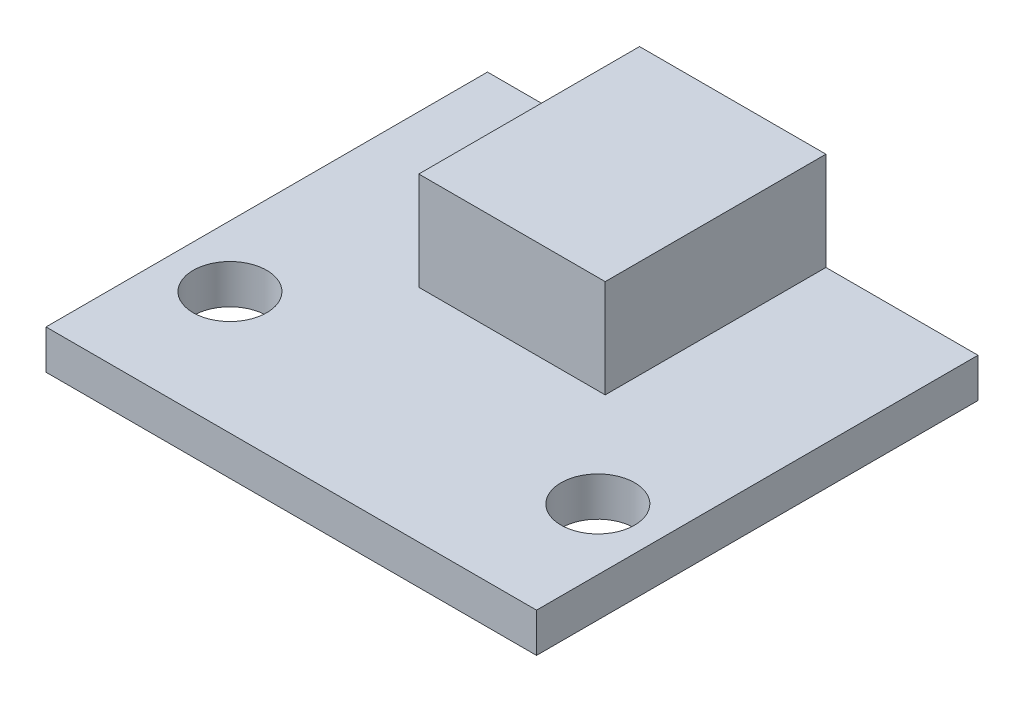
ISO-10303-21;
HEADER;
FILE_DESCRIPTION(('STEP AP214'),'2;1');
FILE_NAME('part.step','',(''),(''),'','','');
FILE_SCHEMA(('AUTOMOTIVE_DESIGN { 1 0 10303 214 1 1 1 1 }'));
ENDSEC;
DATA;
#1=APPLICATION_CONTEXT('core data for automotive mechanical design processes');
#2=APPLICATION_PROTOCOL_DEFINITION('international standard','automotive_design',2000,#1);
#3=PRODUCT_CONTEXT('',#1,'mechanical');
#4=PRODUCT('Part','Part','',(#3));
#5=PRODUCT_RELATED_PRODUCT_CATEGORY('part','',(#4));
#6=PRODUCT_DEFINITION_FORMATION('','',#4);
#7=PRODUCT_DEFINITION_CONTEXT('part definition',#1,'design');
#8=PRODUCT_DEFINITION('design','',#6,#7);
#9=PRODUCT_DEFINITION_SHAPE('','',#8);
#10=(LENGTH_UNIT() NAMED_UNIT(*) SI_UNIT(.MILLI.,.METRE.));
#11=(NAMED_UNIT(*) PLANE_ANGLE_UNIT() SI_UNIT($,.RADIAN.));
#12=(NAMED_UNIT(*) SI_UNIT($,.STERADIAN.) SOLID_ANGLE_UNIT());
#13=UNCERTAINTY_MEASURE_WITH_UNIT(LENGTH_MEASURE(1.E-05),#10,'distance_accuracy_value','');
#14=(GEOMETRIC_REPRESENTATION_CONTEXT(3) GLOBAL_UNCERTAINTY_ASSIGNED_CONTEXT((#13)) GLOBAL_UNIT_ASSIGNED_CONTEXT((#10,
#11,#12)) REPRESENTATION_CONTEXT('',''));
#15=CARTESIAN_POINT('',(0.,0.,0.));
#16=DIRECTION('',(0.,0.,1.));
#17=DIRECTION('',(1.,0.,0.));
#18=AXIS2_PLACEMENT_3D('',#15,#16,#17);
#19=CARTESIAN_POINT('',(0.,1.6,0.));
#20=DIRECTION('',(0.,-1.,0.));
#21=DIRECTION('',(0.,0.,-1.));
#22=AXIS2_PLACEMENT_3D('',#19,#20,#21);
#23=PLANE('',#22);
#24=CARTESIAN_POINT('',(17.5,1.6,-5.));
#25=DIRECTION('',(0.,1.,0.));
#26=DIRECTION('',(0.,0.,-1.));
#27=AXIS2_PLACEMENT_3D('',#24,#25,#26);
#28=CIRCLE('',#27,1.5);
#29=CARTESIAN_POINT('',(17.5,1.6,-6.5));
#30=VERTEX_POINT('',#29);
#31=EDGE_CURVE('E125',#30,#30,#28,.T.);
#32=ORIENTED_EDGE('',*,*,#31,.F.);
#33=EDGE_LOOP('',(#32));
#34=FACE_BOUND('',#33,.T.);
#35=CARTESIAN_POINT('',(2.5,1.6,-5.));
#36=DIRECTION('',(0.,1.,0.));
#37=DIRECTION('',(0.,0.,1.));
#38=AXIS2_PLACEMENT_3D('',#35,#36,#37);
#39=CIRCLE('',#38,1.5);
#40=CARTESIAN_POINT('',(2.5,1.6,-3.5));
#41=VERTEX_POINT('',#40);
#42=EDGE_CURVE('E134',#41,#41,#39,.T.);
#43=ORIENTED_EDGE('',*,*,#42,.F.);
#44=EDGE_LOOP('',(#43));
#45=FACE_BOUND('',#44,.T.);
#46=DIRECTION('',(0.,0.,1.));
#47=VECTOR('',#46,1.);
#48=CARTESIAN_POINT('',(6.2,1.6,-18.));
#49=LINE('',#48,#47);
#50=CARTESIAN_POINT('',(6.2,1.6,-18.));
#51=VERTEX_POINT('',#50);
#52=CARTESIAN_POINT('',(6.2,1.6,-9.));
#53=VERTEX_POINT('',#52);
#54=EDGE_CURVE('E57',#51,#53,#49,.T.);
#55=ORIENTED_EDGE('',*,*,#54,.F.);
#56=DIRECTION('',(-1.,0.,0.));
#57=VECTOR('',#56,1.);
#58=CARTESIAN_POINT('',(0.,1.6,-18.));
#59=LINE('',#58,#57);
#60=CARTESIAN_POINT('',(0.,1.6,-18.));
#61=VERTEX_POINT('',#60);
#62=EDGE_CURVE('E148',#51,#61,#59,.T.);
#63=ORIENTED_EDGE('',*,*,#62,.T.);
#64=DIRECTION('',(0.,0.,1.));
#65=VECTOR('',#64,1.);
#66=CARTESIAN_POINT('',(0.,1.6,0.));
#67=LINE('',#66,#65);
#68=CARTESIAN_POINT('',(0.,1.6,0.));
#69=VERTEX_POINT('',#68);
#70=EDGE_CURVE('E140',#61,#69,#67,.T.);
#71=ORIENTED_EDGE('',*,*,#70,.T.);
#72=DIRECTION('',(1.,0.,0.));
#73=VECTOR('',#72,1.);
#74=CARTESIAN_POINT('',(0.,1.6,0.));
#75=LINE('',#74,#73);
#76=CARTESIAN_POINT('',(20.,1.6,0.));
#77=VERTEX_POINT('',#76);
#78=EDGE_CURVE('E143',#69,#77,#75,.T.);
#79=ORIENTED_EDGE('',*,*,#78,.T.);
#80=DIRECTION('',(0.,0.,-1.));
#81=VECTOR('',#80,1.);
#82=CARTESIAN_POINT('',(20.,1.6,0.));
#83=LINE('',#82,#81);
#84=CARTESIAN_POINT('',(20.,1.6,-18.));
#85=VERTEX_POINT('',#84);
#86=EDGE_CURVE('E146',#77,#85,#83,.T.);
#87=ORIENTED_EDGE('',*,*,#86,.T.);
#88=CARTESIAN_POINT('',(13.8,1.6,-18.));
#89=VERTEX_POINT('',#88);
#90=EDGE_CURVE('E149',#85,#89,#59,.T.);
#91=ORIENTED_EDGE('',*,*,#90,.T.);
#92=DIRECTION('',(0.,0.,-1.));
#93=VECTOR('',#92,1.);
#94=CARTESIAN_POINT('',(13.8,1.6,-18.));
#95=LINE('',#94,#93);
#96=CARTESIAN_POINT('',(13.8,1.6,-9.));
#97=VERTEX_POINT('',#96);
#98=EDGE_CURVE('E119',#97,#89,#95,.T.);
#99=ORIENTED_EDGE('',*,*,#98,.F.);
#100=DIRECTION('',(1.,0.,0.));
#101=VECTOR('',#100,1.);
#102=CARTESIAN_POINT('',(6.2,1.6,-9.));
#103=LINE('',#102,#101);
#104=EDGE_CURVE('E52',#53,#97,#103,.T.);
#105=ORIENTED_EDGE('',*,*,#104,.F.);
#106=EDGE_LOOP('',(#55,#63,#71,#79,#87,#91,#99,#105));
#107=FACE_BOUND('',#106,.T.);
#108=ADVANCED_FACE('F37',(#34,#45,#107),#23,.F.);
#109=CARTESIAN_POINT('',(0.,0.,0.));
#110=DIRECTION('',(0.,-1.,0.));
#111=DIRECTION('',(0.,0.,-1.));
#112=AXIS2_PLACEMENT_3D('',#109,#110,#111);
#113=PLANE('',#112);
#114=CARTESIAN_POINT('',(2.5,0.,-5.));
#115=DIRECTION('',(0.,1.,0.));
#116=DIRECTION('',(0.,0.,1.));
#117=AXIS2_PLACEMENT_3D('',#114,#115,#116);
#118=CIRCLE('',#117,1.5);
#119=CARTESIAN_POINT('',(2.5,0.,-3.5));
#120=VERTEX_POINT('',#119);
#121=EDGE_CURVE('E132',#120,#120,#118,.T.);
#122=ORIENTED_EDGE('',*,*,#121,.T.);
#123=EDGE_LOOP('',(#122));
#124=FACE_BOUND('',#123,.T.);
#125=DIRECTION('',(0.,0.,1.));
#126=VECTOR('',#125,1.);
#127=CARTESIAN_POINT('',(0.,0.,0.));
#128=LINE('',#127,#126);
#129=CARTESIAN_POINT('',(0.,0.,-18.));
#130=VERTEX_POINT('',#129);
#131=CARTESIAN_POINT('',(0.,0.,0.));
#132=VERTEX_POINT('',#131);
#133=EDGE_CURVE('E137',#130,#132,#128,.T.);
#134=ORIENTED_EDGE('',*,*,#133,.F.);
#135=DIRECTION('',(-1.,0.,0.));
#136=VECTOR('',#135,1.);
#137=CARTESIAN_POINT('',(0.,0.,-18.));
#138=LINE('',#137,#136);
#139=CARTESIAN_POINT('',(20.,0.,-18.));
#140=VERTEX_POINT('',#139);
#141=EDGE_CURVE('E144',#140,#130,#138,.T.);
#142=ORIENTED_EDGE('',*,*,#141,.F.);
#143=DIRECTION('',(0.,0.,-1.));
#144=VECTOR('',#143,1.);
#145=CARTESIAN_POINT('',(20.,0.,0.));
#146=LINE('',#145,#144);
#147=CARTESIAN_POINT('',(20.,0.,0.));
#148=VERTEX_POINT('',#147);
#149=EDGE_CURVE('E156',#148,#140,#146,.T.);
#150=ORIENTED_EDGE('',*,*,#149,.F.);
#151=DIRECTION('',(1.,0.,0.));
#152=VECTOR('',#151,1.);
#153=CARTESIAN_POINT('',(0.,0.,0.));
#154=LINE('',#153,#152);
#155=EDGE_CURVE('E154',#132,#148,#154,.T.);
#156=ORIENTED_EDGE('',*,*,#155,.F.);
#157=EDGE_LOOP('',(#134,#142,#150,#156));
#158=FACE_BOUND('',#157,.T.);
#159=CARTESIAN_POINT('',(17.5,0.,-5.));
#160=DIRECTION('',(0.,1.,0.));
#161=DIRECTION('',(0.,0.,-1.));
#162=AXIS2_PLACEMENT_3D('',#159,#160,#161);
#163=CIRCLE('',#162,1.5);
#164=CARTESIAN_POINT('',(17.5,0.,-6.5));
#165=VERTEX_POINT('',#164);
#166=EDGE_CURVE('E122',#165,#165,#163,.T.);
#167=ORIENTED_EDGE('',*,*,#166,.T.);
#168=EDGE_LOOP('',(#167));
#169=FACE_BOUND('',#168,.T.);
#170=ADVANCED_FACE('F174',(#124,#158,#169),#113,.T.);
#171=CARTESIAN_POINT('',(0.,1.6,0.));
#172=DIRECTION('',(1.,0.,0.));
#173=DIRECTION('',(0.,0.,-1.));
#174=AXIS2_PLACEMENT_3D('',#171,#172,#173);
#175=PLANE('',#174);
#176=ORIENTED_EDGE('',*,*,#133,.T.);
#177=DIRECTION('',(0.,-1.,0.));
#178=VECTOR('',#177,1.);
#179=CARTESIAN_POINT('',(0.,1.6,0.));
#180=LINE('',#179,#178);
#181=EDGE_CURVE('E11',#69,#132,#180,.T.);
#182=ORIENTED_EDGE('',*,*,#181,.F.);
#183=ORIENTED_EDGE('',*,*,#70,.F.);
#184=DIRECTION('',(0.,-1.,0.));
#185=VECTOR('',#184,1.);
#186=CARTESIAN_POINT('',(0.,1.6,-18.));
#187=LINE('',#186,#185);
#188=EDGE_CURVE('E151',#61,#130,#187,.T.);
#189=ORIENTED_EDGE('',*,*,#188,.T.);
#190=EDGE_LOOP('',(#176,#182,#183,#189));
#191=FACE_BOUND('',#190,.T.);
#192=ADVANCED_FACE('F39',(#191),#175,.F.);
#193=CARTESIAN_POINT('',(0.,1.6,0.));
#194=DIRECTION('',(0.,0.,-1.));
#195=DIRECTION('',(-1.,0.,0.));
#196=AXIS2_PLACEMENT_3D('',#193,#194,#195);
#197=PLANE('',#196);
#198=ORIENTED_EDGE('',*,*,#155,.T.);
#199=DIRECTION('',(0.,-1.,0.));
#200=VECTOR('',#199,1.);
#201=CARTESIAN_POINT('',(20.,1.6,0.));
#202=LINE('',#201,#200);
#203=EDGE_CURVE('E45',#77,#148,#202,.T.);
#204=ORIENTED_EDGE('',*,*,#203,.F.);
#205=ORIENTED_EDGE('',*,*,#78,.F.);
#206=ORIENTED_EDGE('',*,*,#181,.T.);
#207=EDGE_LOOP('',(#198,#204,#205,#206));
#208=FACE_BOUND('',#207,.T.);
#209=ADVANCED_FACE('F220',(#208),#197,.F.);
#210=CARTESIAN_POINT('',(20.,1.6,0.));
#211=DIRECTION('',(-1.,0.,0.));
#212=DIRECTION('',(0.,0.,1.));
#213=AXIS2_PLACEMENT_3D('',#210,#211,#212);
#214=PLANE('',#213);
#215=ORIENTED_EDGE('',*,*,#149,.T.);
#216=DIRECTION('',(0.,-1.,0.));
#217=VECTOR('',#216,1.);
#218=CARTESIAN_POINT('',(20.,1.6,-18.));
#219=LINE('',#218,#217);
#220=EDGE_CURVE('E161',#85,#140,#219,.T.);
#221=ORIENTED_EDGE('',*,*,#220,.F.);
#222=ORIENTED_EDGE('',*,*,#86,.F.);
#223=ORIENTED_EDGE('',*,*,#203,.T.);
#224=EDGE_LOOP('',(#215,#221,#222,#223));
#225=FACE_BOUND('',#224,.T.);
#226=ADVANCED_FACE('F168',(#225),#214,.F.);
#227=CARTESIAN_POINT('',(0.,1.6,-18.));
#228=DIRECTION('',(0.,0.,1.));
#229=DIRECTION('',(1.,0.,0.));
#230=AXIS2_PLACEMENT_3D('',#227,#228,#229);
#231=PLANE('',#230);
#232=ORIENTED_EDGE('',*,*,#141,.T.);
#233=ORIENTED_EDGE('',*,*,#188,.F.);
#234=ORIENTED_EDGE('',*,*,#62,.F.);
#235=DIRECTION('',(0.,-1.,0.));
#236=VECTOR('',#235,1.);
#237=CARTESIAN_POINT('',(6.2,5.6,-18.));
#238=LINE('',#237,#236);
#239=CARTESIAN_POINT('',(6.2,5.6,-18.));
#240=VERTEX_POINT('',#239);
#241=EDGE_CURVE('E183',#240,#51,#238,.T.);
#242=ORIENTED_EDGE('',*,*,#241,.F.);
#243=DIRECTION('',(-1.,0.,0.));
#244=VECTOR('',#243,1.);
#245=CARTESIAN_POINT('',(6.2,5.6,-18.));
#246=LINE('',#245,#244);
#247=CARTESIAN_POINT('',(13.8,5.6,-18.));
#248=VERTEX_POINT('',#247);
#249=EDGE_CURVE('E115',#248,#240,#246,.T.);
#250=ORIENTED_EDGE('',*,*,#249,.F.);
#251=DIRECTION('',(0.,-1.,0.));
#252=VECTOR('',#251,1.);
#253=CARTESIAN_POINT('',(13.8,5.6,-18.));
#254=LINE('',#253,#252);
#255=EDGE_CURVE('E127',#248,#89,#254,.T.);
#256=ORIENTED_EDGE('',*,*,#255,.T.);
#257=ORIENTED_EDGE('',*,*,#90,.F.);
#258=ORIENTED_EDGE('',*,*,#220,.T.);
#259=EDGE_LOOP('',(#232,#233,#234,#242,#250,#256,#257,#258));
#260=FACE_BOUND('',#259,.T.);
#261=ADVANCED_FACE('F178',(#260),#231,.F.);
#262=CARTESIAN_POINT('',(2.5,1.6,-5.));
#263=DIRECTION('',(0.,-1.,0.));
#264=DIRECTION('',(0.,0.,-1.));
#265=AXIS2_PLACEMENT_3D('',#262,#263,#264);
#266=CYLINDRICAL_SURFACE('',#265,1.5);
#267=ORIENTED_EDGE('',*,*,#42,.T.);
#268=EDGE_LOOP('',(#267));
#269=FACE_BOUND('',#268,.T.);
#270=ORIENTED_EDGE('',*,*,#121,.F.);
#271=EDGE_LOOP('',(#270));
#272=FACE_BOUND('',#271,.T.);
#273=ADVANCED_FACE('F214',(#269,#272),#266,.F.);
#274=CARTESIAN_POINT('',(17.5,1.6,-5.));
#275=DIRECTION('',(0.,-1.,0.));
#276=DIRECTION('',(0.,0.,-1.));
#277=AXIS2_PLACEMENT_3D('',#274,#275,#276);
#278=CYLINDRICAL_SURFACE('',#277,1.5);
#279=ORIENTED_EDGE('',*,*,#31,.T.);
#280=EDGE_LOOP('',(#279));
#281=FACE_BOUND('',#280,.T.);
#282=ORIENTED_EDGE('',*,*,#166,.F.);
#283=EDGE_LOOP('',(#282));
#284=FACE_BOUND('',#283,.T.);
#285=ADVANCED_FACE('F261',(#281,#284),#278,.F.);
#286=CARTESIAN_POINT('',(6.2,5.6,-18.));
#287=DIRECTION('',(1.,0.,0.));
#288=DIRECTION('',(0.,0.,-1.));
#289=AXIS2_PLACEMENT_3D('',#286,#287,#288);
#290=PLANE('',#289);
#291=ORIENTED_EDGE('',*,*,#54,.T.);
#292=DIRECTION('',(0.,-1.,0.));
#293=VECTOR('',#292,1.);
#294=CARTESIAN_POINT('',(6.2,5.6,-9.));
#295=LINE('',#294,#293);
#296=CARTESIAN_POINT('',(6.2,5.6,-9.));
#297=VERTEX_POINT('',#296);
#298=EDGE_CURVE('E104',#297,#53,#295,.T.);
#299=ORIENTED_EDGE('',*,*,#298,.F.);
#300=DIRECTION('',(0.,0.,1.));
#301=VECTOR('',#300,1.);
#302=CARTESIAN_POINT('',(6.2,5.6,-18.));
#303=LINE('',#302,#301);
#304=EDGE_CURVE('E110',#240,#297,#303,.T.);
#305=ORIENTED_EDGE('',*,*,#304,.F.);
#306=ORIENTED_EDGE('',*,*,#241,.T.);
#307=EDGE_LOOP('',(#291,#299,#305,#306));
#308=FACE_BOUND('',#307,.T.);
#309=ADVANCED_FACE('F121',(#308),#290,.F.);
#310=CARTESIAN_POINT('',(6.2,5.6,-9.));
#311=DIRECTION('',(0.,0.,-1.));
#312=DIRECTION('',(-1.,0.,0.));
#313=AXIS2_PLACEMENT_3D('',#310,#311,#312);
#314=PLANE('',#313);
#315=ORIENTED_EDGE('',*,*,#104,.T.);
#316=DIRECTION('',(0.,-1.,0.));
#317=VECTOR('',#316,1.);
#318=CARTESIAN_POINT('',(13.8,5.6,-9.));
#319=LINE('',#318,#317);
#320=CARTESIAN_POINT('',(13.8,5.6,-9.));
#321=VERTEX_POINT('',#320);
#322=EDGE_CURVE('E106',#321,#97,#319,.T.);
#323=ORIENTED_EDGE('',*,*,#322,.F.);
#324=DIRECTION('',(1.,0.,0.));
#325=VECTOR('',#324,1.);
#326=CARTESIAN_POINT('',(6.2,5.6,-9.));
#327=LINE('',#326,#325);
#328=EDGE_CURVE('E100',#297,#321,#327,.T.);
#329=ORIENTED_EDGE('',*,*,#328,.F.);
#330=ORIENTED_EDGE('',*,*,#298,.T.);
#331=EDGE_LOOP('',(#315,#323,#329,#330));
#332=FACE_BOUND('',#331,.T.);
#333=ADVANCED_FACE('F102',(#332),#314,.F.);
#334=CARTESIAN_POINT('',(13.8,5.6,-18.));
#335=DIRECTION('',(-1.,0.,0.));
#336=DIRECTION('',(0.,0.,1.));
#337=AXIS2_PLACEMENT_3D('',#334,#335,#336);
#338=PLANE('',#337);
#339=ORIENTED_EDGE('',*,*,#98,.T.);
#340=ORIENTED_EDGE('',*,*,#255,.F.);
#341=DIRECTION('',(0.,0.,-1.));
#342=VECTOR('',#341,1.);
#343=CARTESIAN_POINT('',(13.8,5.6,-18.));
#344=LINE('',#343,#342);
#345=EDGE_CURVE('E109',#321,#248,#344,.T.);
#346=ORIENTED_EDGE('',*,*,#345,.F.);
#347=ORIENTED_EDGE('',*,*,#322,.T.);
#348=EDGE_LOOP('',(#339,#340,#346,#347));
#349=FACE_BOUND('',#348,.T.);
#350=ADVANCED_FACE('F194',(#349),#338,.F.);
#351=CARTESIAN_POINT('',(0.,5.6,0.));
#352=DIRECTION('',(0.,1.,0.));
#353=DIRECTION('',(0.,0.,1.));
#354=AXIS2_PLACEMENT_3D('',#351,#352,#353);
#355=PLANE('',#354);
#356=ORIENTED_EDGE('',*,*,#304,.T.);
#357=ORIENTED_EDGE('',*,*,#328,.T.);
#358=ORIENTED_EDGE('',*,*,#345,.T.);
#359=ORIENTED_EDGE('',*,*,#249,.T.);
#360=EDGE_LOOP('',(#356,#357,#358,#359));
#361=FACE_BOUND('',#360,.T.);
#362=ADVANCED_FACE('F113',(#361),#355,.T.);
#363=CLOSED_SHELL('',(#108,#170,#192,#209,#226,#261,#273,#285,#309,#333,#350,#362));
#364=MANIFOLD_SOLID_BREP('B2',#363);
#365=ADVANCED_BREP_SHAPE_REPRESENTATION('',(#18,#364),#14);
#366=SHAPE_DEFINITION_REPRESENTATION(#9,#365);
ENDSEC;
END-ISO-10303-21;
